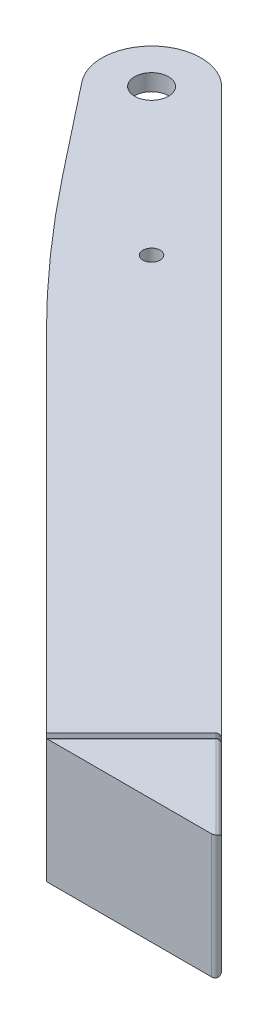
ISO-10303-21;
HEADER;
FILE_DESCRIPTION(('STEP AP214'),'2;1');
FILE_NAME('part.step','',(''),(''),'','','');
FILE_SCHEMA(('AUTOMOTIVE_DESIGN { 1 0 10303 214 1 1 1 1 }'));
ENDSEC;
DATA;
#1=APPLICATION_CONTEXT('core data for automotive mechanical design processes');
#2=APPLICATION_PROTOCOL_DEFINITION('international standard','automotive_design',2000,#1);
#3=PRODUCT_CONTEXT('',#1,'mechanical');
#4=PRODUCT('Part','Part','',(#3));
#5=PRODUCT_RELATED_PRODUCT_CATEGORY('part','',(#4));
#6=PRODUCT_DEFINITION_FORMATION('','',#4);
#7=PRODUCT_DEFINITION_CONTEXT('part definition',#1,'design');
#8=PRODUCT_DEFINITION('design','',#6,#7);
#9=PRODUCT_DEFINITION_SHAPE('','',#8);
#10=(LENGTH_UNIT() NAMED_UNIT(*) SI_UNIT(.MILLI.,.METRE.));
#11=(NAMED_UNIT(*) PLANE_ANGLE_UNIT() SI_UNIT($,.RADIAN.));
#12=(NAMED_UNIT(*) SI_UNIT($,.STERADIAN.) SOLID_ANGLE_UNIT());
#13=UNCERTAINTY_MEASURE_WITH_UNIT(LENGTH_MEASURE(1.E-05),#10,'distance_accuracy_value','');
#14=(GEOMETRIC_REPRESENTATION_CONTEXT(3) GLOBAL_UNCERTAINTY_ASSIGNED_CONTEXT((#13)) GLOBAL_UNIT_ASSIGNED_CONTEXT((#10,
#11,#12)) REPRESENTATION_CONTEXT('',''));
#15=CARTESIAN_POINT('',(0.,0.,0.));
#16=DIRECTION('',(0.,0.,1.));
#17=DIRECTION('',(1.,0.,0.));
#18=AXIS2_PLACEMENT_3D('',#15,#16,#17);
#19=CARTESIAN_POINT('',(0.,0.,0.));
#20=DIRECTION('',(0.,-1.,0.));
#21=DIRECTION('',(0.,0.,-1.));
#22=AXIS2_PLACEMENT_3D('',#19,#20,#21);
#23=PLANE('',#22);
#24=DIRECTION('',(0.707106781186546,0.,0.707106781186549));
#25=VECTOR('',#24,1.);
#26=CARTESIAN_POINT('',(8.48528137423858,0.,-8.48528137423855));
#27=LINE('',#26,#25);
#28=CARTESIAN_POINT('',(8.48528137423858,0.,-8.48528137423855));
#29=VERTEX_POINT('',#28);
#30=CARTESIAN_POINT('',(145.297749429131,0.,128.327186680654));
#31=VERTEX_POINT('',#30);
#32=EDGE_CURVE('E234',#29,#31,#27,.T.);
#33=ORIENTED_EDGE('',*,*,#32,.T.);
#34=CARTESIAN_POINT('',(144.590642647944,0.,129.03429346184));
#35=DIRECTION('',(0.,-1.,0.));
#36=DIRECTION('',(0.707106781186546,0.,0.707106781186549));
#37=AXIS2_PLACEMENT_3D('',#34,#35,#36);
#38=ELLIPSE('',#37,1.83490160644255,1.);
#39=CARTESIAN_POINT('',(143.293171279218,0.,127.736822093115));
#40=VERTEX_POINT('',#39);
#41=EDGE_CURVE('E86',#31,#40,#38,.F.);
#42=ORIENTED_EDGE('',*,*,#41,.T.);
#43=DIRECTION('',(-0.707106781186547,0.,0.707106781186548));
#44=VECTOR('',#43,1.);
#45=CARTESIAN_POINT('',(169.495375628369,0.,101.534617743964));
#46=LINE('',#45,#44);
#47=CARTESIAN_POINT('',(122.787074624809,0.,148.242918747525));
#48=VERTEX_POINT('',#47);
#49=EDGE_CURVE('E214',#40,#48,#46,.T.);
#50=ORIENTED_EDGE('',*,*,#49,.T.);
#51=DIRECTION('',(-0.707106781186548,0.,-0.707106781186547));
#52=VECTOR('',#51,1.);
#53=CARTESIAN_POINT('',(136.92921024854,0.,162.385054371256));
#54=LINE('',#53,#52);
#55=CARTESIAN_POINT('',(39.3030353462218,0.,64.7588794689379));
#56=VERTEX_POINT('',#55);
#57=EDGE_CURVE('E237',#48,#56,#54,.T.);
#58=ORIENTED_EDGE('',*,*,#57,.T.);
#59=CARTESIAN_POINT('',(322.145747820841,0.,-218.083833005681));
#60=DIRECTION('',(0.,-1.,0.));
#61=DIRECTION('',(0.,0.,-1.));
#62=AXIS2_PLACEMENT_3D('',#59,#60,#61);
#63=CIRCLE('',#62,400.);
#64=CARTESIAN_POINT('',(8.02680934566774,0.,29.5636836207338));
#65=VERTEX_POINT('',#64);
#66=EDGE_CURVE('E250',#56,#65,#63,.T.);
#67=ORIENTED_EDGE('',*,*,#66,.T.);
#68=DIRECTION('',(-0.619118791566037,0.,-0.785297346187932));
#69=VECTOR('',#68,1.);
#70=CARTESIAN_POINT('',(22.6274169979693,0.,48.0832611206854));
#71=LINE('',#70,#69);
#72=CARTESIAN_POINT('',(-9.42356815425519,0.,7.42942549879245));
#73=VERTEX_POINT('',#72);
#74=EDGE_CURVE('E239',#65,#73,#71,.T.);
#75=ORIENTED_EDGE('',*,*,#74,.T.);
#76=CARTESIAN_POINT('',(0.,0.,0.));
#77=DIRECTION('',(0.,-1.,0.));
#78=DIRECTION('',(0.,0.,-1.));
#79=AXIS2_PLACEMENT_3D('',#76,#77,#78);
#80=CIRCLE('',#79,12.);
#81=EDGE_CURVE('E231',#73,#29,#80,.T.);
#82=ORIENTED_EDGE('',*,*,#81,.T.);
#83=EDGE_LOOP('',(#33,#42,#50,#58,#67,#75,#82));
#84=FACE_BOUND('',#83,.T.);
#85=CARTESIAN_POINT('',(0.,0.,0.));
#86=DIRECTION('',(0.,1.,0.));
#87=DIRECTION('',(0.,0.,1.));
#88=AXIS2_PLACEMENT_3D('',#85,#86,#87);
#89=CIRCLE('',#88,4.1);
#90=CARTESIAN_POINT('',(0.,0.,4.1));
#91=VERTEX_POINT('',#90);
#92=EDGE_CURVE('E330',#91,#91,#89,.T.);
#93=ORIENTED_EDGE('',*,*,#92,.T.);
#94=EDGE_LOOP('',(#93));
#95=FACE_BOUND('',#94,.T.);
#96=CARTESIAN_POINT('',(35.3553390593274,0.,35.3553390593274));
#97=DIRECTION('',(0.,1.,0.));
#98=DIRECTION('',(0.,0.,1.));
#99=AXIS2_PLACEMENT_3D('',#96,#97,#98);
#100=CIRCLE('',#99,2.1);
#101=CARTESIAN_POINT('',(35.3553390593274,0.,37.4553390593274));
#102=VERTEX_POINT('',#101);
#103=EDGE_CURVE('E213',#102,#102,#100,.T.);
#104=ORIENTED_EDGE('',*,*,#103,.T.);
#105=EDGE_LOOP('',(#104));
#106=FACE_BOUND('',#105,.T.);
#107=ADVANCED_FACE('F77',(#84,#95,#106),#23,.T.);
#108=CARTESIAN_POINT('',(0.,4.,0.));
#109=DIRECTION('',(0.,-1.,0.));
#110=DIRECTION('',(0.,0.,-1.));
#111=AXIS2_PLACEMENT_3D('',#108,#109,#110);
#112=PLANE('',#111);
#113=DIRECTION('',(-0.707106781186548,0.,-0.707106781186547));
#114=VECTOR('',#113,1.);
#115=CARTESIAN_POINT('',(136.92921024854,4.,162.385054371256));
#116=LINE('',#115,#114);
#117=CARTESIAN_POINT('',(122.787074624809,4.,148.242918747525));
#118=VERTEX_POINT('',#117);
#119=CARTESIAN_POINT('',(39.3030353462218,4.,64.7588794689379));
#120=VERTEX_POINT('',#119);
#121=EDGE_CURVE('E196',#118,#120,#116,.T.);
#122=ORIENTED_EDGE('',*,*,#121,.F.);
#123=DIRECTION('',(-0.707106781186547,0.,0.707106781186548));
#124=VECTOR('',#123,1.);
#125=CARTESIAN_POINT('',(169.495375628369,4.,101.534617743964));
#126=LINE('',#125,#124);
#127=CARTESIAN_POINT('',(143.293171279218,4.,127.736822093115));
#128=VERTEX_POINT('',#127);
#129=EDGE_CURVE('E207',#128,#118,#126,.T.);
#130=ORIENTED_EDGE('',*,*,#129,.F.);
#131=CARTESIAN_POINT('',(144.590642647944,4.,129.03429346184));
#132=DIRECTION('',(0.,-1.,0.));
#133=DIRECTION('',(-0.707106781186546,0.,-0.707106781186549));
#134=AXIS2_PLACEMENT_3D('',#131,#132,#133);
#135=ELLIPSE('',#134,1.83490160644255,1.);
#136=CARTESIAN_POINT('',(145.297749429131,4.00000000000002,128.327186680654));
#137=VERTEX_POINT('',#136);
#138=EDGE_CURVE('E12',#128,#137,#135,.T.);
#139=ORIENTED_EDGE('',*,*,#138,.T.);
#140=DIRECTION('',(0.707106781186546,0.,0.707106781186549));
#141=VECTOR('',#140,1.);
#142=CARTESIAN_POINT('',(8.48528137423858,4.,-8.48528137423855));
#143=LINE('',#142,#141);
#144=CARTESIAN_POINT('',(8.48528137423858,4.,-8.48528137423855));
#145=VERTEX_POINT('',#144);
#146=EDGE_CURVE('E223',#145,#137,#143,.T.);
#147=ORIENTED_EDGE('',*,*,#146,.F.);
#148=CARTESIAN_POINT('',(0.,4.,0.));
#149=DIRECTION('',(0.,-1.,0.));
#150=DIRECTION('',(0.,0.,-1.));
#151=AXIS2_PLACEMENT_3D('',#148,#149,#150);
#152=CIRCLE('',#151,12.);
#153=CARTESIAN_POINT('',(-9.42356815425519,4.,7.42942549879245));
#154=VERTEX_POINT('',#153);
#155=EDGE_CURVE('E227',#154,#145,#152,.T.);
#156=ORIENTED_EDGE('',*,*,#155,.F.);
#157=DIRECTION('',(-0.619118791566037,0.,-0.785297346187932));
#158=VECTOR('',#157,1.);
#159=CARTESIAN_POINT('',(22.6274169979693,4.,48.0832611206854));
#160=LINE('',#159,#158);
#161=CARTESIAN_POINT('',(8.02680934566774,4.,29.5636836207338));
#162=VERTEX_POINT('',#161);
#163=EDGE_CURVE('E222',#162,#154,#160,.T.);
#164=ORIENTED_EDGE('',*,*,#163,.F.);
#165=CARTESIAN_POINT('',(322.145747820841,4.,-218.083833005681));
#166=DIRECTION('',(0.,-1.,0.));
#167=DIRECTION('',(0.,0.,-1.));
#168=AXIS2_PLACEMENT_3D('',#165,#166,#167);
#169=CIRCLE('',#168,400.);
#170=EDGE_CURVE('E220',#162,#120,#169,.F.);
#171=ORIENTED_EDGE('',*,*,#170,.T.);
#172=EDGE_LOOP('',(#122,#130,#139,#147,#156,#164,#171));
#173=FACE_BOUND('',#172,.T.);
#174=CARTESIAN_POINT('',(0.,4.,0.));
#175=DIRECTION('',(0.,1.,0.));
#176=DIRECTION('',(0.,0.,1.));
#177=AXIS2_PLACEMENT_3D('',#174,#175,#176);
#178=CIRCLE('',#177,4.1);
#179=CARTESIAN_POINT('',(0.,4.,4.1));
#180=VERTEX_POINT('',#179);
#181=EDGE_CURVE('E235',#180,#180,#178,.T.);
#182=ORIENTED_EDGE('',*,*,#181,.F.);
#183=EDGE_LOOP('',(#182));
#184=FACE_BOUND('',#183,.T.);
#185=CARTESIAN_POINT('',(35.3553390593274,4.,35.3553390593274));
#186=DIRECTION('',(0.,1.,0.));
#187=DIRECTION('',(0.,0.,1.));
#188=AXIS2_PLACEMENT_3D('',#185,#186,#187);
#189=CIRCLE('',#188,2.1);
#190=CARTESIAN_POINT('',(35.3553390593274,4.,37.4553390593274));
#191=VERTEX_POINT('',#190);
#192=EDGE_CURVE('E327',#191,#191,#189,.T.);
#193=ORIENTED_EDGE('',*,*,#192,.F.);
#194=EDGE_LOOP('',(#193));
#195=FACE_BOUND('',#194,.T.);
#196=ADVANCED_FACE('F216',(#173,#184,#195),#112,.F.);
#197=CARTESIAN_POINT('',(0.,4.,0.));
#198=DIRECTION('',(0.,-1.,0.));
#199=DIRECTION('',(0.,0.,-1.));
#200=AXIS2_PLACEMENT_3D('',#197,#198,#199);
#201=CYLINDRICAL_SURFACE('',#200,12.);
#202=ORIENTED_EDGE('',*,*,#81,.F.);
#203=DIRECTION('',(0.,-1.,0.));
#204=VECTOR('',#203,1.);
#205=CARTESIAN_POINT('',(-9.42356815425519,4.,7.42942549879245));
#206=LINE('',#205,#204);
#207=EDGE_CURVE('E241',#154,#73,#206,.T.);
#208=ORIENTED_EDGE('',*,*,#207,.F.);
#209=ORIENTED_EDGE('',*,*,#155,.T.);
#210=DIRECTION('',(0.,-1.,0.));
#211=VECTOR('',#210,1.);
#212=CARTESIAN_POINT('',(8.48528137423858,4.,-8.48528137423855));
#213=LINE('',#212,#211);
#214=EDGE_CURVE('E225',#145,#29,#213,.T.);
#215=ORIENTED_EDGE('',*,*,#214,.T.);
#216=EDGE_LOOP('',(#202,#208,#209,#215));
#217=FACE_BOUND('',#216,.T.);
#218=ADVANCED_FACE('F341',(#217),#201,.T.);
#219=CARTESIAN_POINT('',(22.6274169979693,4.,48.0832611206854));
#220=DIRECTION('',(-0.785297346187932,0.,0.619118791566037));
#221=DIRECTION('',(0.619118791566037,0.,0.785297346187932));
#222=AXIS2_PLACEMENT_3D('',#219,#220,#221);
#223=PLANE('',#222);
#224=ORIENTED_EDGE('',*,*,#74,.F.);
#225=DIRECTION('',(0.,-1.,0.));
#226=VECTOR('',#225,1.);
#227=CARTESIAN_POINT('',(8.02680934566774,4.,29.5636836207338));
#228=LINE('',#227,#226);
#229=EDGE_CURVE('E252',#65,#162,#228,.F.);
#230=ORIENTED_EDGE('',*,*,#229,.T.);
#231=ORIENTED_EDGE('',*,*,#163,.T.);
#232=ORIENTED_EDGE('',*,*,#207,.T.);
#233=EDGE_LOOP('',(#224,#230,#231,#232));
#234=FACE_BOUND('',#233,.T.);
#235=ADVANCED_FACE('F355',(#234),#223,.T.);
#236=CARTESIAN_POINT('',(136.92921024854,4.,162.385054371256));
#237=DIRECTION('',(-0.707106781186547,0.,0.707106781186548));
#238=DIRECTION('',(0.707106781186548,0.,0.707106781186547));
#239=AXIS2_PLACEMENT_3D('',#236,#237,#238);
#240=PLANE('',#239);
#241=DIRECTION('',(0.592869166728752,-0.544988350595415,0.592869166728752));
#242=VECTOR('',#241,1.);
#243=CARTESIAN_POINT('',(122.787074624809,0.,148.242918747525));
#244=LINE('',#243,#242);
#245=CARTESIAN_POINT('',(136.753460072451,-12.8384436163006,162.209304195167));
#246=VERTEX_POINT('',#245);
#247=EDGE_CURVE('E203',#48,#246,#244,.T.);
#248=ORIENTED_EDGE('',*,*,#247,.T.);
#249=CARTESIAN_POINT('',(137.138825030824,-12.,162.59466915354));
#250=DIRECTION('',(-0.707106781186547,0.,0.707106781186548));
#251=DIRECTION('',(0.707106781186548,0.,0.707106781186547));
#252=AXIS2_PLACEMENT_3D('',#249,#250,#251);
#253=CIRCLE('',#252,1.);
#254=CARTESIAN_POINT('',(136.92921024854,-12.9550514573024,162.385054371256));
#255=VERTEX_POINT('',#254);
#256=EDGE_CURVE('E275',#246,#255,#253,.T.);
#257=ORIENTED_EDGE('',*,*,#256,.T.);
#258=DIRECTION('',(0.,-1.,0.));
#259=VECTOR('',#258,1.);
#260=CARTESIAN_POINT('',(136.92921024854,4.,162.385054371256));
#261=LINE('',#260,#259);
#262=CARTESIAN_POINT('',(136.92921024854,16.9550514573024,162.385054371256));
#263=VERTEX_POINT('',#262);
#264=EDGE_CURVE('E245',#263,#255,#261,.T.);
#265=ORIENTED_EDGE('',*,*,#264,.F.);
#266=CARTESIAN_POINT('',(137.138825030824,16.,162.59466915354));
#267=DIRECTION('',(-0.707106781186547,0.,0.707106781186548));
#268=DIRECTION('',(0.707106781186548,0.,0.707106781186547));
#269=AXIS2_PLACEMENT_3D('',#266,#267,#268);
#270=CIRCLE('',#269,1.);
#271=CARTESIAN_POINT('',(136.753460072451,16.8384436163006,162.209304195167));
#272=VERTEX_POINT('',#271);
#273=EDGE_CURVE('E200',#263,#272,#270,.T.);
#274=ORIENTED_EDGE('',*,*,#273,.T.);
#275=DIRECTION('',(-0.592869166728752,-0.544988350595415,-0.592869166728752));
#276=VECTOR('',#275,1.);
#277=CARTESIAN_POINT('',(136.92921024854,17.,162.385054371256));
#278=LINE('',#277,#276);
#279=EDGE_CURVE('E190',#272,#118,#278,.T.);
#280=ORIENTED_EDGE('',*,*,#279,.T.);
#281=ORIENTED_EDGE('',*,*,#121,.T.);
#282=DIRECTION('',(0.,-1.,0.));
#283=VECTOR('',#282,1.);
#284=CARTESIAN_POINT('',(39.3030353462218,4.,64.7588794689379));
#285=LINE('',#284,#283);
#286=EDGE_CURVE('E244',#120,#56,#285,.T.);
#287=ORIENTED_EDGE('',*,*,#286,.T.);
#288=ORIENTED_EDGE('',*,*,#57,.F.);
#289=EDGE_LOOP('',(#248,#257,#265,#274,#280,#281,#287,#288));
#290=FACE_BOUND('',#289,.T.);
#291=ADVANCED_FACE('F193',(#290),#240,.T.);
#292=CARTESIAN_POINT('',(136.92921024854,4.,162.385054371256));
#293=DIRECTION('',(0.,0.,-1.));
#294=DIRECTION('',(-1.,0.,0.));
#295=AXIS2_PLACEMENT_3D('',#292,#293,#294);
#296=PLANE('',#295);
#297=ORIENTED_EDGE('',*,*,#264,.T.);
#298=CARTESIAN_POINT('',(137.348439813109,-12.,162.385054371256));
#299=DIRECTION('',(0.,0.,-1.));
#300=DIRECTION('',(1.,0.,0.));
#301=AXIS2_PLACEMENT_3D('',#298,#299,#300);
#302=ELLIPSE('',#301,1.41421356237309,1.);
#303=CARTESIAN_POINT('',(137.348439813109,-13.,162.385054371256));
#304=VERTEX_POINT('',#303);
#305=EDGE_CURVE('E281',#255,#304,#302,.F.);
#306=ORIENTED_EDGE('',*,*,#305,.T.);
#307=DIRECTION('',(-1.,0.,0.));
#308=VECTOR('',#307,1.);
#309=CARTESIAN_POINT('',(175.443222712306,-13.,162.385054371256));
#310=LINE('',#309,#308);
#311=CARTESIAN_POINT('',(176.941403557359,-13.,162.385054371256));
#312=VERTEX_POINT('',#311);
#313=EDGE_CURVE('E316',#312,#304,#310,.T.);
#314=ORIENTED_EDGE('',*,*,#313,.F.);
#315=DIRECTION('',(0.,-1.,0.));
#316=VECTOR('',#315,1.);
#317=CARTESIAN_POINT('',(176.941403557359,17.,162.385054371256));
#318=LINE('',#317,#316);
#319=CARTESIAN_POINT('',(176.941403557359,17.,162.385054371256));
#320=VERTEX_POINT('',#319);
#321=EDGE_CURVE('E279',#312,#320,#318,.F.);
#322=ORIENTED_EDGE('',*,*,#321,.T.);
#323=DIRECTION('',(1.,0.,0.));
#324=VECTOR('',#323,1.);
#325=CARTESIAN_POINT('',(196.656426147903,17.,162.385054371256));
#326=LINE('',#325,#324);
#327=CARTESIAN_POINT('',(137.348439813109,17.,162.385054371256));
#328=VERTEX_POINT('',#327);
#329=EDGE_CURVE('E204',#328,#320,#326,.T.);
#330=ORIENTED_EDGE('',*,*,#329,.F.);
#331=CARTESIAN_POINT('',(137.348439813109,16.,162.385054371256));
#332=DIRECTION('',(0.,0.,-1.));
#333=DIRECTION('',(1.,0.,0.));
#334=AXIS2_PLACEMENT_3D('',#331,#332,#333);
#335=ELLIPSE('',#334,1.4142135623731,1.);
#336=EDGE_CURVE('E277',#328,#263,#335,.F.);
#337=ORIENTED_EDGE('',*,*,#336,.T.);
#338=EDGE_LOOP('',(#297,#306,#314,#322,#330,#337));
#339=FACE_BOUND('',#338,.T.);
#340=ADVANCED_FACE('F371',(#339),#296,.F.);
#341=CARTESIAN_POINT('',(8.48528137423858,4.,-8.48528137423855));
#342=DIRECTION('',(0.707106781186549,0.,-0.707106781186546));
#343=DIRECTION('',(-0.707106781186546,0.,-0.707106781186549));
#344=AXIS2_PLACEMENT_3D('',#341,#342,#343);
#345=PLANE('',#344);
#346=DIRECTION('',(0.592869166728751,-0.544988350595415,0.592869166728753));
#347=VECTOR('',#346,1.);
#348=CARTESIAN_POINT('',(47.827840335298,89.5981237864513,30.857277586821));
#349=LINE('',#348,#347);
#350=CARTESIAN_POINT('',(158.352028466421,-12.,141.381465717944));
#351=VERTEX_POINT('',#350);
#352=EDGE_CURVE('E268',#351,#31,#349,.F.);
#353=ORIENTED_EDGE('',*,*,#352,.T.);
#354=ORIENTED_EDGE('',*,*,#32,.F.);
#355=ORIENTED_EDGE('',*,*,#214,.F.);
#356=ORIENTED_EDGE('',*,*,#146,.T.);
#357=DIRECTION('',(-0.592869166728751,-0.544988350595415,-0.592869166728753));
#358=VECTOR('',#357,1.);
#359=CARTESIAN_POINT('',(49.1202674924755,-84.4100745773125,32.1497047439985));
#360=LINE('',#359,#358);
#361=CARTESIAN_POINT('',(158.352028466421,16.,141.381465717944));
#362=VERTEX_POINT('',#361);
#363=EDGE_CURVE('E266',#137,#362,#360,.F.);
#364=ORIENTED_EDGE('',*,*,#363,.T.);
#365=DIRECTION('',(-0.707106781186546,0.,-0.707106781186549));
#366=VECTOR('',#365,1.);
#367=CARTESIAN_POINT('',(179.355617119732,16.,162.385054371256));
#368=LINE('',#367,#366);
#369=CARTESIAN_POINT('',(177.648510338546,16.,160.677947590069));
#370=VERTEX_POINT('',#369);
#371=EDGE_CURVE('E260',#362,#370,#368,.F.);
#372=ORIENTED_EDGE('',*,*,#371,.T.);
#373=DIRECTION('',(0.,-1.,0.));
#374=VECTOR('',#373,1.);
#375=CARTESIAN_POINT('',(177.648510338546,-13.,160.677947590069));
#376=LINE('',#375,#374);
#377=CARTESIAN_POINT('',(177.648510338546,-12.,160.677947590069));
#378=VERTEX_POINT('',#377);
#379=EDGE_CURVE('E262',#370,#378,#376,.T.);
#380=ORIENTED_EDGE('',*,*,#379,.T.);
#381=DIRECTION('',(-0.707106781186546,0.,-0.707106781186549));
#382=VECTOR('',#381,1.);
#383=CARTESIAN_POINT('',(158.142413684136,-12.,141.171850935659));
#384=LINE('',#383,#382);
#385=EDGE_CURVE('E264',#378,#351,#384,.T.);
#386=ORIENTED_EDGE('',*,*,#385,.T.);
#387=EDGE_LOOP('',(#353,#354,#355,#356,#364,#372,#380,#386));
#388=FACE_BOUND('',#387,.T.);
#389=ADVANCED_FACE('F346',(#388),#345,.T.);
#390=CARTESIAN_POINT('',(0.,4.,0.));
#391=DIRECTION('',(0.,-1.,0.));
#392=DIRECTION('',(0.,0.,-1.));
#393=AXIS2_PLACEMENT_3D('',#390,#391,#392);
#394=CYLINDRICAL_SURFACE('',#393,4.1);
#395=ORIENTED_EDGE('',*,*,#181,.T.);
#396=EDGE_LOOP('',(#395));
#397=FACE_BOUND('',#396,.T.);
#398=ORIENTED_EDGE('',*,*,#92,.F.);
#399=EDGE_LOOP('',(#398));
#400=FACE_BOUND('',#399,.T.);
#401=ADVANCED_FACE('F422',(#397,#400),#394,.F.);
#402=CARTESIAN_POINT('',(35.3553390593274,4.,35.3553390593274));
#403=DIRECTION('',(0.,-1.,0.));
#404=DIRECTION('',(0.,0.,-1.));
#405=AXIS2_PLACEMENT_3D('',#402,#403,#404);
#406=CYLINDRICAL_SURFACE('',#405,2.1);
#407=ORIENTED_EDGE('',*,*,#192,.T.);
#408=EDGE_LOOP('',(#407));
#409=FACE_BOUND('',#408,.T.);
#410=ORIENTED_EDGE('',*,*,#103,.F.);
#411=EDGE_LOOP('',(#410));
#412=FACE_BOUND('',#411,.T.);
#413=ADVANCED_FACE('F426',(#409,#412),#406,.F.);
#414=CARTESIAN_POINT('',(322.145747820841,4.,-218.083833005681));
#415=DIRECTION('',(0.,-1.,0.));
#416=DIRECTION('',(0.,0.,-1.));
#417=AXIS2_PLACEMENT_3D('',#414,#415,#416);
#418=CYLINDRICAL_SURFACE('',#417,400.);
#419=ORIENTED_EDGE('',*,*,#170,.F.);
#420=ORIENTED_EDGE('',*,*,#229,.F.);
#421=ORIENTED_EDGE('',*,*,#66,.F.);
#422=ORIENTED_EDGE('',*,*,#286,.F.);
#423=EDGE_LOOP('',(#419,#420,#421,#422));
#424=FACE_BOUND('',#423,.T.);
#425=ADVANCED_FACE('F357',(#424),#418,.T.);
#426=CARTESIAN_POINT('',(169.495375628369,0.,101.534617743964));
#427=DIRECTION('',(-0.385364958373689,-0.838443616300637,-0.385364958373689));
#428=DIRECTION('',(0.908621700848509,-0.417620168032104,0.));
#429=AXIS2_PLACEMENT_3D('',#426,#427,#428);
#430=PLANE('',#429);
#431=ORIENTED_EDGE('',*,*,#49,.F.);
#432=DIRECTION('',(0.592869166728751,-0.544988350595415,0.592869166728753));
#433=VECTOR('',#432,1.);
#434=CARTESIAN_POINT('',(143.293171279218,0.,127.736822093115));
#435=LINE('',#434,#433);
#436=CARTESIAN_POINT('',(157.25955672686,-12.8384436163006,141.703207540757));
#437=VERTEX_POINT('',#436);
#438=EDGE_CURVE('E257',#40,#437,#435,.T.);
#439=ORIENTED_EDGE('',*,*,#438,.T.);
#440=DIRECTION('',(-0.707106781186548,0.,0.707106781186548));
#441=VECTOR('',#440,1.);
#442=CARTESIAN_POINT('',(136.753460072451,-12.8384436163006,162.209304195167));
#443=LINE('',#442,#441);
#444=EDGE_CURVE('E255',#437,#246,#443,.T.);
#445=ORIENTED_EDGE('',*,*,#444,.T.);
#446=ORIENTED_EDGE('',*,*,#247,.F.);
#447=EDGE_LOOP('',(#431,#439,#445,#446));
#448=FACE_BOUND('',#447,.T.);
#449=ADVANCED_FACE('F363',(#448),#430,.T.);
#450=CARTESIAN_POINT('',(183.6375112521,17.,115.676753367695));
#451=DIRECTION('',(-0.38536495837369,0.838443616300637,-0.385364958373689));
#452=DIRECTION('',(-0.908621700848509,-0.417620168032104,0.));
#453=AXIS2_PLACEMENT_3D('',#450,#451,#452);
#454=PLANE('',#453);
#455=DIRECTION('',(-0.707106781186547,0.,0.707106781186548));
#456=VECTOR('',#455,1.);
#457=CARTESIAN_POINT('',(157.966663508047,16.8384436163006,140.99610075957));
#458=LINE('',#457,#456);
#459=CARTESIAN_POINT('',(157.25955672686,16.8384436163006,141.703207540757));
#460=VERTEX_POINT('',#459);
#461=EDGE_CURVE('E271',#272,#460,#458,.F.);
#462=ORIENTED_EDGE('',*,*,#461,.T.);
#463=DIRECTION('',(-0.592869166728751,-0.544988350595415,-0.592869166728753));
#464=VECTOR('',#463,1.);
#465=CARTESIAN_POINT('',(157.435306902949,17.,141.878957716846));
#466=LINE('',#465,#464);
#467=EDGE_CURVE('E210',#460,#128,#466,.T.);
#468=ORIENTED_EDGE('',*,*,#467,.T.);
#469=ORIENTED_EDGE('',*,*,#129,.T.);
#470=ORIENTED_EDGE('',*,*,#279,.F.);
#471=EDGE_LOOP('',(#462,#468,#469,#470));
#472=FACE_BOUND('',#471,.T.);
#473=ADVANCED_FACE('F208',(#472),#454,.T.);
#474=CARTESIAN_POINT('',(196.656426147903,17.,179.685863399426));
#475=DIRECTION('',(0.,-1.,0.));
#476=DIRECTION('',(0.,0.,-1.));
#477=AXIS2_PLACEMENT_3D('',#474,#475,#476);
#478=PLANE('',#477);
#479=ORIENTED_EDGE('',*,*,#329,.T.);
#480=CARTESIAN_POINT('',(176.941403557359,17.,161.385054371256));
#481=DIRECTION('',(0.,-1.,0.));
#482=DIRECTION('',(0.,0.,-1.));
#483=AXIS2_PLACEMENT_3D('',#480,#481,#482);
#484=CIRCLE('',#483,1.);
#485=CARTESIAN_POINT('',(177.648510338546,17.,162.092161152442));
#486=VERTEX_POINT('',#485);
#487=EDGE_CURVE('E94',#320,#486,#484,.F.);
#488=ORIENTED_EDGE('',*,*,#487,.T.);
#489=DIRECTION('',(-0.707106781186546,0.,-0.707106781186549));
#490=VECTOR('',#489,1.);
#491=CARTESIAN_POINT('',(157.435306902949,17.,141.878957716846));
#492=LINE('',#491,#490);
#493=CARTESIAN_POINT('',(157.644921685234,17.,142.088572499131));
#494=VERTEX_POINT('',#493);
#495=EDGE_CURVE('E98',#486,#494,#492,.T.);
#496=ORIENTED_EDGE('',*,*,#495,.T.);
#497=DIRECTION('',(-0.707106781186547,0.,0.707106781186548));
#498=VECTOR('',#497,1.);
#499=CARTESIAN_POINT('',(137.138825030824,17.,162.59466915354));
#500=LINE('',#499,#498);
#501=EDGE_CURVE('E289',#494,#328,#500,.T.);
#502=ORIENTED_EDGE('',*,*,#501,.T.);
#503=EDGE_LOOP('',(#479,#488,#496,#502));
#504=FACE_BOUND('',#503,.T.);
#505=ADVANCED_FACE('F442',(#504),#478,.F.);
#506=CARTESIAN_POINT('',(175.443222712306,-13.,200.899066835022));
#507=DIRECTION('',(0.,1.,0.));
#508=DIRECTION('',(0.,0.,1.));
#509=AXIS2_PLACEMENT_3D('',#506,#507,#508);
#510=PLANE('',#509);
#511=ORIENTED_EDGE('',*,*,#313,.T.);
#512=DIRECTION('',(-0.707106781186547,0.,0.707106781186548));
#513=VECTOR('',#512,1.);
#514=CARTESIAN_POINT('',(158.352028466421,-13.,141.381465717944));
#515=LINE('',#514,#513);
#516=CARTESIAN_POINT('',(157.644921685234,-13.,142.088572499131));
#517=VERTEX_POINT('',#516);
#518=EDGE_CURVE('E287',#304,#517,#515,.F.);
#519=ORIENTED_EDGE('',*,*,#518,.T.);
#520=DIRECTION('',(-0.707106781186546,0.,-0.707106781186549));
#521=VECTOR('',#520,1.);
#522=CARTESIAN_POINT('',(178.648510338546,-13.,163.092161152442));
#523=LINE('',#522,#521);
#524=CARTESIAN_POINT('',(177.648510338546,-13.,162.092161152442));
#525=VERTEX_POINT('',#524);
#526=EDGE_CURVE('E285',#517,#525,#523,.F.);
#527=ORIENTED_EDGE('',*,*,#526,.T.);
#528=CARTESIAN_POINT('',(176.941403557359,-13.,161.385054371256));
#529=DIRECTION('',(0.,1.,0.));
#530=DIRECTION('',(0.,0.,1.));
#531=AXIS2_PLACEMENT_3D('',#528,#529,#530);
#532=CIRCLE('',#531,1.);
#533=EDGE_CURVE('E283',#525,#312,#532,.F.);
#534=ORIENTED_EDGE('',*,*,#533,.T.);
#535=EDGE_LOOP('',(#511,#519,#527,#534));
#536=FACE_BOUND('',#535,.T.);
#537=ADVANCED_FACE('F445',(#536),#510,.F.);
#538=CARTESIAN_POINT('',(158.352028466421,16.,141.381465717944));
#539=DIRECTION('',(0.707106781186547,0.,-0.707106781186547));
#540=DIRECTION('',(-0.707106781186548,0.,-0.707106781186547));
#541=AXIS2_PLACEMENT_3D('',#538,#539,#540);
#542=CYLINDRICAL_SURFACE('',#541,1.);
#543=ORIENTED_EDGE('',*,*,#336,.F.);
#544=ORIENTED_EDGE('',*,*,#501,.F.);
#545=CARTESIAN_POINT('',(157.644921685234,16.,142.088572499131));
#546=DIRECTION('',(0.707106781186547,0.,-0.707106781186547));
#547=DIRECTION('',(-0.707106781186548,0.,-0.707106781186548));
#548=AXIS2_PLACEMENT_3D('',#545,#546,#547);
#549=CIRCLE('',#548,1.);
#550=EDGE_CURVE('E81',#460,#494,#549,.T.);
#551=ORIENTED_EDGE('',*,*,#550,.F.);
#552=ORIENTED_EDGE('',*,*,#461,.F.);
#553=ORIENTED_EDGE('',*,*,#273,.F.);
#554=EDGE_LOOP('',(#543,#544,#551,#552,#553));
#555=FACE_BOUND('',#554,.T.);
#556=ADVANCED_FACE('F79',(#555),#542,.T.);
#557=CARTESIAN_POINT('',(157.820671861323,16.1615563836993,142.264322675219));
#558=DIRECTION('',(-0.592869166728751,-0.544988350595415,-0.592869166728753));
#559=DIRECTION('',(-0.707106781186549,0.,0.707106781186546));
#560=AXIS2_PLACEMENT_3D('',#557,#558,#559);
#561=CYLINDRICAL_SURFACE('',#560,1.);
#562=ORIENTED_EDGE('',*,*,#138,.F.);
#563=ORIENTED_EDGE('',*,*,#467,.F.);
#564=CARTESIAN_POINT('',(157.644921685234,16.,142.088572499131));
#565=DIRECTION('',(0.592869166728748,0.544988350595424,0.592869166728748));
#566=DIRECTION('',(0.707106781186548,0.,-0.707106781186548));
#567=AXIS2_PLACEMENT_3D('',#564,#565,#566);
#568=CIRCLE('',#567,1.);
#569=EDGE_CURVE('E310',#362,#460,#568,.T.);
#570=ORIENTED_EDGE('',*,*,#569,.F.);
#571=ORIENTED_EDGE('',*,*,#363,.F.);
#572=EDGE_LOOP('',(#562,#563,#570,#571));
#573=FACE_BOUND('',#572,.T.);
#574=ADVANCED_FACE('F376',(#573),#561,.T.);
#575=CARTESIAN_POINT('',(157.644921685234,16.,142.088572499131));
#576=DIRECTION('',(0.707106781186547,0.,-0.707106781186547));
#577=DIRECTION('',(-0.707106781186548,0.,-0.707106781186548));
#578=AXIS2_PLACEMENT_3D('',#575,#576,#577);
#579=SPHERICAL_SURFACE('',#578,1.);
#580=ORIENTED_EDGE('',*,*,#569,.T.);
#581=ORIENTED_EDGE('',*,*,#550,.T.);
#582=CARTESIAN_POINT('',(157.644921685234,16.,142.088572499131));
#583=DIRECTION('',(-0.707106781186534,0.,-0.707106781186561));
#584=DIRECTION('',(-0.707106781186561,0.,0.707106781186534));
#585=AXIS2_PLACEMENT_3D('',#582,#583,#584);
#586=CIRCLE('',#585,1.);
#587=EDGE_CURVE('E308',#362,#494,#586,.F.);
#588=ORIENTED_EDGE('',*,*,#587,.F.);
#589=EDGE_LOOP('',(#580,#581,#588));
#590=FACE_BOUND('',#589,.T.);
#591=ADVANCED_FACE('F378',(#590),#579,.T.);
#592=CARTESIAN_POINT('',(195.949319366716,16.,180.392970180613));
#593=DIRECTION('',(0.707106781186546,0.,0.707106781186549));
#594=DIRECTION('',(0.707106781186549,0.,-0.707106781186546));
#595=AXIS2_PLACEMENT_3D('',#592,#593,#594);
#596=CYLINDRICAL_SURFACE('',#595,1.);
#597=ORIENTED_EDGE('',*,*,#587,.T.);
#598=ORIENTED_EDGE('',*,*,#495,.F.);
#599=CARTESIAN_POINT('',(176.941403557359,16.,161.385054371256));
#600=DIRECTION('',(0.499999999999999,-0.707106781186547,0.500000000000001));
#601=DIRECTION('',(0.499999999999999,0.707106781186547,0.500000000000001));
#602=AXIS2_PLACEMENT_3D('',#599,#600,#601);
#603=ELLIPSE('',#602,1.41421356237309,1.);
#604=EDGE_CURVE('E305',#370,#486,#603,.T.);
#605=ORIENTED_EDGE('',*,*,#604,.F.);
#606=ORIENTED_EDGE('',*,*,#371,.F.);
#607=EDGE_LOOP('',(#597,#598,#605,#606));
#608=FACE_BOUND('',#607,.T.);
#609=ADVANCED_FACE('F381',(#608),#596,.T.);
#610=CARTESIAN_POINT('',(176.941403557359,4.,161.385054371256));
#611=DIRECTION('',(0.,1.,0.));
#612=DIRECTION('',(0.,0.,1.));
#613=AXIS2_PLACEMENT_3D('',#610,#611,#612);
#614=CYLINDRICAL_SURFACE('',#613,1.);
#615=ORIENTED_EDGE('',*,*,#321,.F.);
#616=ORIENTED_EDGE('',*,*,#533,.F.);
#617=CARTESIAN_POINT('',(176.941403557359,-12.,161.385054371256));
#618=DIRECTION('',(0.499999999999999,0.707106781186547,0.500000000000001));
#619=DIRECTION('',(-0.499999999999999,0.707106781186547,-0.500000000000001));
#620=AXIS2_PLACEMENT_3D('',#617,#618,#619);
#621=ELLIPSE('',#620,1.41421356237309,1.);
#622=EDGE_CURVE('E302',#378,#525,#621,.F.);
#623=ORIENTED_EDGE('',*,*,#622,.F.);
#624=ORIENTED_EDGE('',*,*,#379,.F.);
#625=ORIENTED_EDGE('',*,*,#604,.T.);
#626=ORIENTED_EDGE('',*,*,#487,.F.);
#627=EDGE_LOOP('',(#615,#616,#623,#624,#625,#626));
#628=FACE_BOUND('',#627,.T.);
#629=ADVANCED_FACE('F389',(#628),#614,.T.);
#630=CARTESIAN_POINT('',(183.847126034385,-12.,115.88636814998));
#631=DIRECTION('',(0.707106781186548,0.,-0.707106781186548));
#632=DIRECTION('',(-0.707106781186548,0.,-0.707106781186547));
#633=AXIS2_PLACEMENT_3D('',#630,#631,#632);
#634=CYLINDRICAL_SURFACE('',#633,1.);
#635=ORIENTED_EDGE('',*,*,#256,.F.);
#636=ORIENTED_EDGE('',*,*,#444,.F.);
#637=CARTESIAN_POINT('',(157.644921685234,-12.,142.088572499131));
#638=DIRECTION('',(0.707106781186522,0.,-0.707106781186573));
#639=DIRECTION('',(-0.707106781186573,0.,-0.707106781186522));
#640=AXIS2_PLACEMENT_3D('',#637,#638,#639);
#641=CIRCLE('',#640,1.);
#642=EDGE_CURVE('E299',#517,#437,#641,.T.);
#643=ORIENTED_EDGE('',*,*,#642,.F.);
#644=ORIENTED_EDGE('',*,*,#518,.F.);
#645=ORIENTED_EDGE('',*,*,#305,.F.);
#646=EDGE_LOOP('',(#635,#636,#643,#644,#645));
#647=FACE_BOUND('',#646,.T.);
#648=ADVANCED_FACE('F368',(#647),#634,.T.);
#649=CARTESIAN_POINT('',(7.77817459305203,-12.,-7.778174593052));
#650=DIRECTION('',(0.707106781186546,0.,0.707106781186549));
#651=DIRECTION('',(0.707106781186549,0.,-0.707106781186546));
#652=AXIS2_PLACEMENT_3D('',#649,#650,#651);
#653=CYLINDRICAL_SURFACE('',#652,1.);
#654=ORIENTED_EDGE('',*,*,#622,.T.);
#655=ORIENTED_EDGE('',*,*,#526,.F.);
#656=CARTESIAN_POINT('',(157.644921685234,-12.,142.088572499131));
#657=DIRECTION('',(-0.707106781186547,0.,-0.707106781186547));
#658=DIRECTION('',(-0.707106781186548,0.,0.707106781186548));
#659=AXIS2_PLACEMENT_3D('',#656,#657,#658);
#660=CIRCLE('',#659,1.);
#661=EDGE_CURVE('E296',#351,#517,#660,.T.);
#662=ORIENTED_EDGE('',*,*,#661,.F.);
#663=ORIENTED_EDGE('',*,*,#385,.F.);
#664=EDGE_LOOP('',(#654,#655,#662,#663));
#665=FACE_BOUND('',#664,.T.);
#666=ADVANCED_FACE('F392',(#665),#653,.T.);
#667=CARTESIAN_POINT('',(157.644921685234,-12.,142.088572499131));
#668=DIRECTION('',(0.707106781186561,0.,-0.707106781186534));
#669=DIRECTION('',(-0.707106781186534,0.,-0.707106781186561));
#670=AXIS2_PLACEMENT_3D('',#667,#668,#669);
#671=SPHERICAL_SURFACE('',#670,1.);
#672=ORIENTED_EDGE('',*,*,#661,.T.);
#673=ORIENTED_EDGE('',*,*,#642,.T.);
#674=CARTESIAN_POINT('',(157.644921685234,-12.,142.088572499131));
#675=DIRECTION('',(0.592869166728741,-0.544988350595411,0.592869166728766));
#676=DIRECTION('',(0.707106781186562,0.,-0.707106781186533));
#677=AXIS2_PLACEMENT_3D('',#674,#675,#676);
#678=CIRCLE('',#677,1.);
#679=EDGE_CURVE('E294',#351,#437,#678,.F.);
#680=ORIENTED_EDGE('',*,*,#679,.F.);
#681=EDGE_LOOP('',(#672,#673,#680));
#682=FACE_BOUND('',#681,.T.);
#683=ADVANCED_FACE('F397',(#682),#671,.T.);
#684=CARTESIAN_POINT('',(143.678536237592,0.83844361630067,128.122187051489));
#685=DIRECTION('',(0.592869166728751,-0.544988350595415,0.592869166728753));
#686=DIRECTION('',(0.707106781186549,0.,-0.707106781186546));
#687=AXIS2_PLACEMENT_3D('',#684,#685,#686);
#688=CYLINDRICAL_SURFACE('',#687,1.);
#689=ORIENTED_EDGE('',*,*,#41,.F.);
#690=ORIENTED_EDGE('',*,*,#352,.F.);
#691=ORIENTED_EDGE('',*,*,#679,.T.);
#692=ORIENTED_EDGE('',*,*,#438,.F.);
#693=EDGE_LOOP('',(#689,#690,#691,#692));
#694=FACE_BOUND('',#693,.T.);
#695=ADVANCED_FACE('F396',(#694),#688,.T.);
#696=CLOSED_SHELL('',(#107,#196,#218,#235,#291,#340,#389,#401,#413,#425,#449,#473,#505,#537,
#556,#574,#591,#609,#629,#648,#666,#683,#695));
#697=MANIFOLD_SOLID_BREP('B2',#696);
#698=ADVANCED_BREP_SHAPE_REPRESENTATION('',(#18,#697),#14);
#699=SHAPE_DEFINITION_REPRESENTATION(#9,#698);
ENDSEC;
END-ISO-10303-21;
